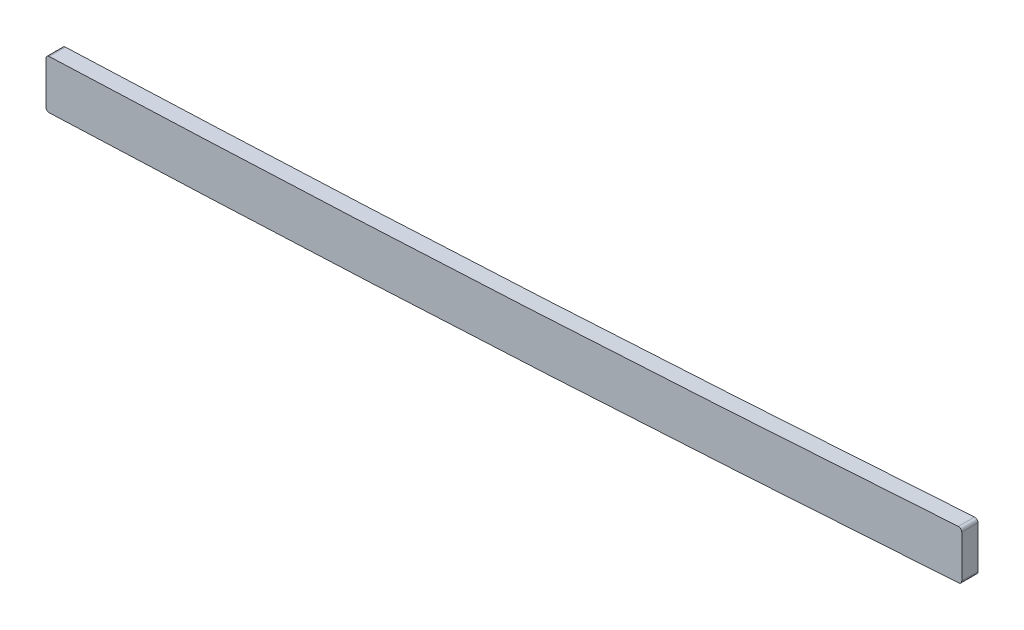
ISO-10303-21;
HEADER;
FILE_DESCRIPTION(('STEP AP214'),'2;1');
FILE_NAME('part.step','',(''),(''),'','','');
FILE_SCHEMA(('AUTOMOTIVE_DESIGN { 1 0 10303 214 1 1 1 1 }'));
ENDSEC;
DATA;
#1=APPLICATION_CONTEXT('core data for automotive mechanical design processes');
#2=APPLICATION_PROTOCOL_DEFINITION('international standard','automotive_design',2000,#1);
#3=PRODUCT_CONTEXT('',#1,'mechanical');
#4=PRODUCT('Part','Part','',(#3));
#5=PRODUCT_RELATED_PRODUCT_CATEGORY('part','',(#4));
#6=PRODUCT_DEFINITION_FORMATION('','',#4);
#7=PRODUCT_DEFINITION_CONTEXT('part definition',#1,'design');
#8=PRODUCT_DEFINITION('design','',#6,#7);
#9=PRODUCT_DEFINITION_SHAPE('','',#8);
#10=(LENGTH_UNIT() NAMED_UNIT(*) SI_UNIT(.MILLI.,.METRE.));
#11=(NAMED_UNIT(*) PLANE_ANGLE_UNIT() SI_UNIT($,.RADIAN.));
#12=(NAMED_UNIT(*) SI_UNIT($,.STERADIAN.) SOLID_ANGLE_UNIT());
#13=UNCERTAINTY_MEASURE_WITH_UNIT(LENGTH_MEASURE(1.E-05),#10,'distance_accuracy_value','');
#14=(GEOMETRIC_REPRESENTATION_CONTEXT(3) GLOBAL_UNCERTAINTY_ASSIGNED_CONTEXT((#13)) GLOBAL_UNIT_ASSIGNED_CONTEXT((#10,
#11,#12)) REPRESENTATION_CONTEXT('',''));
#15=CARTESIAN_POINT('',(0.,0.,0.));
#16=DIRECTION('',(0.,0.,1.));
#17=DIRECTION('',(1.,0.,0.));
#18=AXIS2_PLACEMENT_3D('',#15,#16,#17);
#19=CARTESIAN_POINT('',(2669.54,6.20943054630084E-11,3.175));
#20=DIRECTION('',(1.,0.,0.));
#21=DIRECTION('',(0.,1.,0.));
#22=AXIS2_PLACEMENT_3D('',#19,#20,#21);
#23=PLANE('',#22);
#24=DIRECTION('',(0.,-1.,0.));
#25=VECTOR('',#24,1.);
#26=CARTESIAN_POINT('',(2669.54,6.20943054630084E-11,-3.175));
#27=LINE('',#26,#25);
#28=CARTESIAN_POINT('',(2669.54,8.16576508272443,-3.175));
#29=VERTEX_POINT('',#28);
#30=CARTESIAN_POINT('',(2669.54,-8.38067282995173,-3.175));
#31=VERTEX_POINT('',#30);
#32=EDGE_CURVE('E140',#29,#31,#27,.T.);
#33=ORIENTED_EDGE('',*,*,#32,.F.);
#34=DIRECTION('',(0.,0.,1.));
#35=VECTOR('',#34,1.);
#36=CARTESIAN_POINT('',(2669.54,8.16576508272443,3.175));
#37=LINE('',#36,#35);
#38=CARTESIAN_POINT('',(2669.54,8.16576508272443,3.175));
#39=VERTEX_POINT('',#38);
#40=EDGE_CURVE('E114',#29,#39,#37,.T.);
#41=ORIENTED_EDGE('',*,*,#40,.T.);
#42=DIRECTION('',(0.,-1.,0.));
#43=VECTOR('',#42,1.);
#44=CARTESIAN_POINT('',(2669.54,6.20943054630084E-11,3.175));
#45=LINE('',#44,#43);
#46=CARTESIAN_POINT('',(2669.54,-8.38067282995173,3.175));
#47=VERTEX_POINT('',#46);
#48=EDGE_CURVE('E215',#39,#47,#45,.T.);
#49=ORIENTED_EDGE('',*,*,#48,.T.);
#50=DIRECTION('',(0.,0.,-1.));
#51=VECTOR('',#50,1.);
#52=CARTESIAN_POINT('',(2669.54,-8.38067282995173,3.175));
#53=LINE('',#52,#51);
#54=EDGE_CURVE('E120',#47,#31,#53,.T.);
#55=ORIENTED_EDGE('',*,*,#54,.T.);
#56=EDGE_LOOP('',(#33,#41,#49,#55));
#57=FACE_BOUND('',#56,.T.);
#58=ADVANCED_FACE('F41',(#57),#23,.T.);
#59=CARTESIAN_POINT('',(2698.48667469404,11.4806601503293,3.175));
#60=CARTESIAN_POINT('',(2691.24737670604,10.9833200828121,3.175));
#61=CARTESIAN_POINT('',(2679.19516047804,10.1655376868452,3.175));
#62=CARTESIAN_POINT('',(2662.27652557768,9.03876140898899,3.175));
#63=CARTESIAN_POINT('',(2635.66628230206,7.2924691456857,3.175));
#64=CARTESIAN_POINT('',(2596.85766552893,4.8260568530791,3.175));
#65=CARTESIAN_POINT('',(2545.72974303923,1.75834409257586,3.175));
#66=CARTESIAN_POINT('',(2494.40530570724,-1.09855523520035,3.175));
#67=CARTESIAN_POINT('',(2451.53302226734,-3.26657329681936,3.175));
#68=CARTESIAN_POINT('',(2417.1983167563,-4.86708361008882,3.175));
#69=CARTESIAN_POINT('',(2391.45707691927,-6.00358923536048,3.175));
#70=CARTESIAN_POINT('',(2365.63473630713,-7.08685458139135,3.175));
#71=CARTESIAN_POINT('',(2341.01564201859,-8.07854239792197,3.175));
#72=CARTESIAN_POINT('',(2320.75075371474,-8.87838665592377,3.175));
#73=CARTESIAN_POINT('',(2303.44750893366,-9.5580697754435,3.175));
#74=CARTESIAN_POINT('',(2284.76007664293,-10.2922011195427,3.175));
#75=CARTESIAN_POINT('',(2261.7633474368,-11.2010322967668,3.175));
#76=CARTESIAN_POINT('',(2227.28532971514,-12.5838425566113,3.175));
#77=CARTESIAN_POINT('',(2184.17556939327,-14.3660723604172,3.175));
#78=CARTESIAN_POINT('',(2132.42906611447,-16.6074278682384,3.175));
#79=CARTESIAN_POINT('',(2063.42552339989,-19.708920484548,3.175));
#80=CARTESIAN_POINT('',(1977.17490763451,-23.7005433130483,3.175));
#81=CARTESIAN_POINT('',(1873.73245143151,-28.149389220677,3.175));
#82=CARTESIAN_POINT('',(1770.37461881016,-31.6574686487852,3.175));
#83=CARTESIAN_POINT('',(1667.08568781321,-33.7931175563218,3.175));
#84=CARTESIAN_POINT('',(1581.01109449057,-34.3831888311612,3.175));
#85=CARTESIAN_POINT('',(1512.07397125959,-34.4278026003723,3.175));
#86=CARTESIAN_POINT('',(1443.06151347714,-34.4095104024296,3.175));
#87=CARTESIAN_POINT('',(1356.80092787913,-34.4244328117572,3.175));
#88=CARTESIAN_POINT('',(1218.79462695393,-34.4184647879491,3.175));
#89=CARTESIAN_POINT('',(1115.28902278569,-34.4207027968771,3.175));
#90=CARTESIAN_POINT('',(1046.28548189005,-34.4207027968771,3.175));
#91=B_SPLINE_CURVE_WITH_KNOTS('',3,(#59,#60,#61,#62,#63,#64,#65,#66,#67,#68,#69,#70,#71,#72,#73,
#74,#75,#76,#77,#78,#79,#80,#81,#82,#83,#84,#85,#86,#87,#88,#89,#90),.UNSPECIFIED.,.F.,.F.,(4,1,
1,1,1,1,1,1,1,1,1,1,1,1,1,1,1,1,1,1,1,1,1,1,1,1,1,1,1,4),(100.654804519159,102.842388131745,
104.300777206802,105.766098402935,110.877392286712,115.988686170488,121.099980054264,
126.21127393804,128.766920879929,131.322567821817,133.878214763705,136.433861705593,
138.557690156206,139.83551362715,141.545155589369,144.100802531257,146.656449473146,
151.767743356922,156.879037240698,161.990331124474,172.212918892027,182.43550665958,
192.658094427132,202.880682194685,213.103269962237,218.214563846014,223.32585772979,
233.548445497342,243.771033264895,264.2162088),.UNSPECIFIED.);
#92=DIRECTION('',(0.,0.,-1.));
#93=VECTOR('',#92,1.);
#94=SURFACE_OF_LINEAR_EXTRUSION('',#91,#93);
#95=CARTESIAN_POINT('',(2668.1857171688,9.4329653054066,3.175));
#96=VERTEX_POINT('',#95);
#97=CARTESIAN_POINT('',(2312.62011977482,-9.19769933440686,3.175));
#98=VERTEX_POINT('',#97);
#99=EDGE_CURVE('E130',#96,#98,#91,.T.);
#100=ORIENTED_EDGE('',*,*,#99,.F.);
#101=DIRECTION('',(0.,0.,-1.));
#102=VECTOR('',#101,1.);
#103=CARTESIAN_POINT('',(2668.18571716881,9.43296530540671,3.175));
#104=LINE('',#103,#102);
#105=CARTESIAN_POINT('',(2668.18571716881,9.43296530540666,-3.175));
#106=VERTEX_POINT('',#105);
#107=EDGE_CURVE('E113',#96,#106,#104,.T.);
#108=ORIENTED_EDGE('',*,*,#107,.T.);
#109=CARTESIAN_POINT('',(2698.48667469404,11.4806601503293,-3.175));
#110=CARTESIAN_POINT('',(2691.24737670604,10.9833200828121,-3.175));
#111=CARTESIAN_POINT('',(2679.19516047804,10.1655376868452,-3.175));
#112=CARTESIAN_POINT('',(2662.27652557768,9.03876140898899,-3.175));
#113=CARTESIAN_POINT('',(2635.66628230206,7.2924691456857,-3.175));
#114=CARTESIAN_POINT('',(2596.85766552893,4.8260568530791,-3.175));
#115=CARTESIAN_POINT('',(2545.72974303923,1.75834409257586,-3.175));
#116=CARTESIAN_POINT('',(2494.40530570724,-1.09855523520035,-3.175));
#117=CARTESIAN_POINT('',(2451.53302226734,-3.26657329681936,-3.175));
#118=CARTESIAN_POINT('',(2417.1983167563,-4.86708361008882,-3.175));
#119=CARTESIAN_POINT('',(2391.45707691927,-6.00358923536048,-3.175));
#120=CARTESIAN_POINT('',(2365.63473630713,-7.08685458139135,-3.175));
#121=CARTESIAN_POINT('',(2341.01564201859,-8.07854239792197,-3.175));
#122=CARTESIAN_POINT('',(2320.75075371474,-8.87838665592377,-3.175));
#123=CARTESIAN_POINT('',(2303.44750893366,-9.5580697754435,-3.175));
#124=CARTESIAN_POINT('',(2284.76007664293,-10.2922011195427,-3.175));
#125=CARTESIAN_POINT('',(2261.7633474368,-11.2010322967668,-3.175));
#126=CARTESIAN_POINT('',(2227.28532971514,-12.5838425566113,-3.175));
#127=CARTESIAN_POINT('',(2184.17556939327,-14.3660723604172,-3.175));
#128=CARTESIAN_POINT('',(2132.42906611447,-16.6074278682384,-3.175));
#129=CARTESIAN_POINT('',(2063.42552339989,-19.708920484548,-3.175));
#130=CARTESIAN_POINT('',(1977.17490763451,-23.7005433130483,-3.175));
#131=CARTESIAN_POINT('',(1873.73245143151,-28.149389220677,-3.175));
#132=CARTESIAN_POINT('',(1770.37461881016,-31.6574686487852,-3.175));
#133=CARTESIAN_POINT('',(1667.08568781321,-33.7931175563218,-3.175));
#134=CARTESIAN_POINT('',(1581.01109449057,-34.3831888311612,-3.175));
#135=CARTESIAN_POINT('',(1512.07397125959,-34.4278026003723,-3.175));
#136=CARTESIAN_POINT('',(1443.06151347714,-34.4095104024296,-3.175));
#137=CARTESIAN_POINT('',(1356.80092787913,-34.4244328117572,-3.175));
#138=CARTESIAN_POINT('',(1218.79462695393,-34.4184647879491,-3.175));
#139=CARTESIAN_POINT('',(1115.28902278569,-34.4207027968771,-3.175));
#140=CARTESIAN_POINT('',(1046.28548189005,-34.4207027968771,-3.175));
#141=B_SPLINE_CURVE_WITH_KNOTS('',3,(#109,#110,#111,#112,#113,#114,#115,#116,#117,#118,#119,
#120,#121,#122,#123,#124,#125,#126,#127,#128,#129,#130,#131,#132,#133,#134,#135,#136,#137,#138,
#139,#140),.UNSPECIFIED.,.F.,.F.,(4,1,1,1,1,1,1,1,1,1,1,1,1,1,1,1,1,1,1,1,1,1,1,1,1,1,1,1,1,4),
(100.654804519159,102.842388131745,104.300777206802,105.766098402935,110.877392286712,
115.988686170488,121.099980054264,126.21127393804,128.766920879929,131.322567821817,
133.878214763705,136.433861705593,138.557690156206,139.83551362715,141.545155589369,
144.100802531257,146.656449473146,151.767743356922,156.879037240698,161.990331124474,
172.212918892027,182.43550665958,192.658094427132,202.880682194685,213.103269962237,
218.214563846014,223.32585772979,233.548445497342,243.771033264895,264.2162088),.UNSPECIFIED.);
#142=CARTESIAN_POINT('',(2312.62011977482,-9.19769933440686,-3.175));
#143=VERTEX_POINT('',#142);
#144=EDGE_CURVE('E127',#106,#143,#141,.T.);
#145=ORIENTED_EDGE('',*,*,#144,.T.);
#146=DIRECTION('',(0.,0.,-1.));
#147=VECTOR('',#146,1.);
#148=CARTESIAN_POINT('',(2312.62011977482,-9.19769933440686,-3.175));
#149=LINE('',#148,#147);
#150=EDGE_CURVE('E133',#143,#98,#149,.F.);
#151=ORIENTED_EDGE('',*,*,#150,.T.);
#152=EDGE_LOOP('',(#100,#108,#145,#151));
#153=FACE_BOUND('',#152,.T.);
#154=ADVANCED_FACE('F126',(#153),#94,.F.);
#155=CARTESIAN_POINT('',(2311.4,5.38412677974243E-11,3.175));
#156=DIRECTION('',(1.,0.,0.));
#157=DIRECTION('',(0.,1.,0.));
#158=AXIS2_PLACEMENT_3D('',#155,#156,#157);
#159=PLANE('',#158);
#160=DIRECTION('',(0.,-1.,0.));
#161=VECTOR('',#160,1.);
#162=CARTESIAN_POINT('',(2311.4,5.38412677974243E-11,3.175));
#163=LINE('',#162,#161);
#164=CARTESIAN_POINT('',(2311.4,-10.4667194142858,3.175));
#165=VERTEX_POINT('',#164);
#166=CARTESIAN_POINT('',(2311.4,-26.989466917101,3.175));
#167=VERTEX_POINT('',#166);
#168=EDGE_CURVE('E209',#165,#167,#163,.T.);
#169=ORIENTED_EDGE('',*,*,#168,.F.);
#170=DIRECTION('',(0.,0.,-1.));
#171=VECTOR('',#170,1.);
#172=CARTESIAN_POINT('',(2311.4,-10.4667194142858,3.175));
#173=LINE('',#172,#171);
#174=CARTESIAN_POINT('',(2311.4,-10.4667194142858,-3.175));
#175=VERTEX_POINT('',#174);
#176=EDGE_CURVE('E11',#165,#175,#173,.T.);
#177=ORIENTED_EDGE('',*,*,#176,.T.);
#178=DIRECTION('',(0.,-1.,0.));
#179=VECTOR('',#178,1.);
#180=CARTESIAN_POINT('',(2311.4,5.38412677974243E-11,-3.175));
#181=LINE('',#180,#179);
#182=CARTESIAN_POINT('',(2311.4,-26.989466917101,-3.175));
#183=VERTEX_POINT('',#182);
#184=EDGE_CURVE('E139',#175,#183,#181,.T.);
#185=ORIENTED_EDGE('',*,*,#184,.T.);
#186=DIRECTION('',(0.,0.,1.));
#187=VECTOR('',#186,1.);
#188=CARTESIAN_POINT('',(2311.4,-26.989466917101,3.175));
#189=LINE('',#188,#187);
#190=EDGE_CURVE('E50',#183,#167,#189,.T.);
#191=ORIENTED_EDGE('',*,*,#190,.T.);
#192=EDGE_LOOP('',(#169,#177,#185,#191));
#193=FACE_BOUND('',#192,.T.);
#194=ADVANCED_FACE('F179',(#193),#159,.F.);
#195=CARTESIAN_POINT('',(2699.79233294449,-7.52454325644929,3.175));
#196=CARTESIAN_POINT('',(2639.63682069028,-11.6572294058032,3.175));
#197=CARTESIAN_POINT('',(2579.48130742255,-15.435846921513,3.175));
#198=CARTESIAN_POINT('',(2518.49810546626,-19.1485286488731,3.175));
#199=CARTESIAN_POINT('',(2436.3555443117,-23.2523639114786,3.175));
#200=CARTESIAN_POINT('',(2354.21298315715,-26.6314864233564,3.175));
#201=CARTESIAN_POINT('',(2332.5703304682,-27.4809881692809,3.175));
#202=CARTESIAN_POINT('',(2156.26863942885,-34.3777685431634,3.175));
#203=CARTESIAN_POINT('',(1979.96694737597,-41.6286312484567,3.175));
#204=CARTESIAN_POINT('',(1824.11427763497,-52.7712658766203,3.175));
#205=CARTESIAN_POINT('',(1636.92860677809,-53.5795698486924,3.175));
#206=CARTESIAN_POINT('',(1449.7429359212,-53.4540246131279,3.175));
#207=CARTESIAN_POINT('',(1418.00673093479,-53.4707027968771,3.175));
#208=CARTESIAN_POINT('',(1324.89933614602,-53.4707027968771,3.175));
#209=CARTESIAN_POINT('',(1231.79194034372,-53.4707027968771,3.175));
#210=CARTESIAN_POINT('',(1170.4412693194,-53.4707027968771,3.175));
#211=CARTESIAN_POINT('',(1108.78407581299,-53.4707027968771,3.175));
#212=CARTESIAN_POINT('',(1047.12688234629,-53.4707027968771,3.175));
#213=CARTESIAN_POINT('',(1046.84641418849,-53.4707027968771,3.175));
#214=CARTESIAN_POINT('',(1046.56594718406,-53.4707027968771,3.175));
#215=CARTESIAN_POINT('',(1046.28548189005,-53.4707027968771,3.175));
#216=(BOUNDED_CURVE() B_SPLINE_CURVE(5,(#195,#196,#197,#198,#199,#200,#201,#202,#203,#204,#205,
#206,#207,#208,#209,#210,#211,#212,#213,#214,#215),.UNSPECIFIED.,.F.,
.F.) B_SPLINE_CURVE_WITH_KNOTS((6,3,3,3,3,3,6),(100.654804519159,130.927896619159,
141.337054719159,218.101815019159,233.772059419159,264.077723219159,264.2162088),
.UNSPECIFIED.) CURVE() GEOMETRIC_REPRESENTATION_ITEM() RATIONAL_B_SPLINE_CURVE((1.,1.,1.,1.,1.,
1.,1.,1.,1.,1.,1.,1.,1.,1.,1.,1.,1.,1.,1.,1.,1.)) REPRESENTATION_ITEM(''));
#217=DIRECTION('',(0.,0.,-1.));
#218=VECTOR('',#217,1.);
#219=SURFACE_OF_LINEAR_EXTRUSION('',#216,#218);
#220=CARTESIAN_POINT('',(2312.71987514369,-28.2584871967033,-3.175));
#221=CARTESIAN_POINT('',(2329.40547783021,-27.6027081900987,-3.175));
#222=CARTESIAN_POINT('',(2346.19503632831,-26.9408313965916,-3.175));
#223=CARTESIAN_POINT('',(2363.08398911934,-26.2644441857733,-3.175));
#224=CARTESIAN_POINT('',(2434.40380877238,-23.2965631449422,-3.175));
#225=CARTESIAN_POINT('',(2505.72362842541,-19.7823585871208,-3.175));
#226=CARTESIAN_POINT('',(2560.35960699296,-16.5784214349998,-3.175));
#227=CARTESIAN_POINT('',(2614.44199917946,-13.229682637772,-3.175));
#228=CARTESIAN_POINT('',(2668.35419031106,-9.64787920285397,-3.175));
#229=(BOUNDED_CURVE() B_SPLINE_CURVE(5,(#220,#221,#222,#223,#224,#225,#226,#227,#228),
.UNSPECIFIED.,.F.,.F.) B_SPLINE_CURVE_WITH_KNOTS((6,3,6),(103.818173568317,112.030586893093,
139.140309943934),
.UNSPECIFIED.) CURVE() GEOMETRIC_REPRESENTATION_ITEM() RATIONAL_B_SPLINE_CURVE((1.,1.,1.,1.,1.,
1.,1.,1.,1.)) REPRESENTATION_ITEM(''));
#230=CARTESIAN_POINT('',(2668.35419046547,-9.64788152706516,-3.175));
#231=VERTEX_POINT('',#230);
#232=CARTESIAN_POINT('',(2312.71987502721,-28.2584842330797,-3.175));
#233=VERTEX_POINT('',#232);
#234=EDGE_CURVE('E145',#231,#233,#229,.F.);
#235=ORIENTED_EDGE('',*,*,#234,.F.);
#236=DIRECTION('',(0.,0.,-1.));
#237=VECTOR('',#236,1.);
#238=CARTESIAN_POINT('',(2668.35419031102,-9.64787920285633,-3.175));
#239=LINE('',#238,#237);
#240=CARTESIAN_POINT('',(2668.35419046551,-9.64788152744234,3.175));
#241=VERTEX_POINT('',#240);
#242=EDGE_CURVE('E64',#231,#241,#239,.F.);
#243=ORIENTED_EDGE('',*,*,#242,.T.);
#244=CARTESIAN_POINT('',(2668.35419031106,-9.64787920285402,3.175));
#245=CARTESIAN_POINT('',(2614.44199917946,-13.229682637772,3.175));
#246=CARTESIAN_POINT('',(2560.35960699296,-16.5784214349999,3.175));
#247=CARTESIAN_POINT('',(2505.72362842541,-19.7823585871209,3.175));
#248=CARTESIAN_POINT('',(2434.40380877238,-23.2965631449419,3.175));
#249=CARTESIAN_POINT('',(2363.08398911935,-26.2644441857729,3.175));
#250=CARTESIAN_POINT('',(2346.19503632833,-26.9408313965909,3.175));
#251=CARTESIAN_POINT('',(2329.40547783023,-27.6027081900979,3.175));
#252=CARTESIAN_POINT('',(2312.71987514372,-28.2584871967023,3.175));
#253=(BOUNDED_CURVE() B_SPLINE_CURVE(5,(#244,#245,#246,#247,#248,#249,#250,#251,#252),
.UNSPECIFIED.,.F.,.F.) B_SPLINE_CURVE_WITH_KNOTS((6,3,6),(103.818173568318,130.927896619159,
139.140309943932),
.UNSPECIFIED.) CURVE() GEOMETRIC_REPRESENTATION_ITEM() RATIONAL_B_SPLINE_CURVE((1.,1.,1.,1.,1.,
1.,1.,1.,1.)) REPRESENTATION_ITEM(''));
#254=CARTESIAN_POINT('',(2312.7198750272,-28.2584842327322,3.175));
#255=VERTEX_POINT('',#254);
#256=EDGE_CURVE('E207',#241,#255,#253,.T.);
#257=ORIENTED_EDGE('',*,*,#256,.T.);
#258=DIRECTION('',(0.,0.,-1.));
#259=VECTOR('',#258,1.);
#260=CARTESIAN_POINT('',(2312.71987514529,-28.2584871966404,3.175));
#261=LINE('',#260,#259);
#262=EDGE_CURVE('E247',#255,#233,#261,.T.);
#263=ORIENTED_EDGE('',*,*,#262,.T.);
#264=EDGE_LOOP('',(#235,#243,#257,#263));
#265=FACE_BOUND('',#264,.T.);
#266=ADVANCED_FACE('F168',(#265),#219,.T.);
#267=CARTESIAN_POINT('',(0.,0.,3.175));
#268=DIRECTION('',(0.,0.,1.));
#269=DIRECTION('',(1.,0.,0.));
#270=AXIS2_PLACEMENT_3D('',#267,#268,#269);
#271=PLANE('',#270);
#272=ORIENTED_EDGE('',*,*,#48,.F.);
#273=CARTESIAN_POINT('',(2668.27,8.1657650827244,3.175));
#274=DIRECTION('',(0.,0.,1.));
#275=DIRECTION('',(1.,0.,0.));
#276=AXIS2_PLACEMENT_3D('',#273,#274,#275);
#277=CIRCLE('',#276,1.27);
#278=EDGE_CURVE('E242',#39,#96,#277,.T.);
#279=ORIENTED_EDGE('',*,*,#278,.T.);
#280=ORIENTED_EDGE('',*,*,#99,.T.);
#281=CARTESIAN_POINT('',(2312.67,-10.4667194142858,3.175));
#282=DIRECTION('',(0.,0.,1.));
#283=DIRECTION('',(1.,0.,0.));
#284=AXIS2_PLACEMENT_3D('',#281,#282,#283);
#285=CIRCLE('',#284,1.27);
#286=EDGE_CURVE('E232',#98,#165,#285,.T.);
#287=ORIENTED_EDGE('',*,*,#286,.T.);
#288=ORIENTED_EDGE('',*,*,#168,.T.);
#289=CARTESIAN_POINT('',(2312.67,-26.989466917101,3.175));
#290=DIRECTION('',(0.,0.,1.));
#291=DIRECTION('',(1.,0.,0.));
#292=AXIS2_PLACEMENT_3D('',#289,#290,#291);
#293=CIRCLE('',#292,1.27);
#294=EDGE_CURVE('E57',#167,#255,#293,.T.);
#295=ORIENTED_EDGE('',*,*,#294,.T.);
#296=ORIENTED_EDGE('',*,*,#256,.F.);
#297=CARTESIAN_POINT('',(2668.27,-8.38067282995176,3.175));
#298=DIRECTION('',(0.,0.,1.));
#299=DIRECTION('',(1.,0.,0.));
#300=AXIS2_PLACEMENT_3D('',#297,#298,#299);
#301=CIRCLE('',#300,1.27);
#302=EDGE_CURVE('E235',#241,#47,#301,.T.);
#303=ORIENTED_EDGE('',*,*,#302,.T.);
#304=EDGE_LOOP('',(#272,#279,#280,#287,#288,#295,#296,#303));
#305=FACE_BOUND('',#304,.T.);
#306=ADVANCED_FACE('F178',(#305),#271,.T.);
#307=CARTESIAN_POINT('',(0.,0.,-3.175));
#308=DIRECTION('',(0.,0.,1.));
#309=DIRECTION('',(1.,0.,0.));
#310=AXIS2_PLACEMENT_3D('',#307,#308,#309);
#311=PLANE('',#310);
#312=ORIENTED_EDGE('',*,*,#144,.F.);
#313=CARTESIAN_POINT('',(2668.27,8.1657650827244,-3.175));
#314=DIRECTION('',(0.,0.,1.));
#315=DIRECTION('',(1.,0.,0.));
#316=AXIS2_PLACEMENT_3D('',#313,#314,#315);
#317=CIRCLE('',#316,1.27);
#318=EDGE_CURVE('E109',#106,#29,#317,.F.);
#319=ORIENTED_EDGE('',*,*,#318,.T.);
#320=ORIENTED_EDGE('',*,*,#32,.T.);
#321=CARTESIAN_POINT('',(2668.27,-8.38067282995176,-3.175));
#322=DIRECTION('',(0.,0.,1.));
#323=DIRECTION('',(1.,0.,0.));
#324=AXIS2_PLACEMENT_3D('',#321,#322,#323);
#325=CIRCLE('',#324,1.27);
#326=EDGE_CURVE('E121',#31,#231,#325,.F.);
#327=ORIENTED_EDGE('',*,*,#326,.T.);
#328=ORIENTED_EDGE('',*,*,#234,.T.);
#329=CARTESIAN_POINT('',(2312.67,-26.989466917101,-3.175));
#330=DIRECTION('',(0.,0.,1.));
#331=DIRECTION('',(1.,0.,0.));
#332=AXIS2_PLACEMENT_3D('',#329,#330,#331);
#333=CIRCLE('',#332,1.27);
#334=EDGE_CURVE('E132',#233,#183,#333,.F.);
#335=ORIENTED_EDGE('',*,*,#334,.T.);
#336=ORIENTED_EDGE('',*,*,#184,.F.);
#337=CARTESIAN_POINT('',(2312.67,-10.4667194142858,-3.175));
#338=DIRECTION('',(0.,0.,1.));
#339=DIRECTION('',(1.,0.,0.));
#340=AXIS2_PLACEMENT_3D('',#337,#338,#339);
#341=CIRCLE('',#340,1.27);
#342=EDGE_CURVE('E137',#175,#143,#341,.F.);
#343=ORIENTED_EDGE('',*,*,#342,.T.);
#344=EDGE_LOOP('',(#312,#319,#320,#327,#328,#335,#336,#343));
#345=FACE_BOUND('',#344,.T.);
#346=ADVANCED_FACE('F135',(#345),#311,.F.);
#347=CARTESIAN_POINT('',(2668.27,8.1657650827244,0.));
#348=DIRECTION('',(0.,0.,-1.));
#349=DIRECTION('',(-1.,0.,0.));
#350=AXIS2_PLACEMENT_3D('',#347,#348,#349);
#351=CYLINDRICAL_SURFACE('',#350,1.27);
#352=ORIENTED_EDGE('',*,*,#278,.F.);
#353=ORIENTED_EDGE('',*,*,#40,.F.);
#354=ORIENTED_EDGE('',*,*,#318,.F.);
#355=ORIENTED_EDGE('',*,*,#107,.F.);
#356=EDGE_LOOP('',(#352,#353,#354,#355));
#357=FACE_BOUND('',#356,.T.);
#358=ADVANCED_FACE('F112',(#357),#351,.T.);
#359=CARTESIAN_POINT('',(2668.27,-8.38067282995176,0.));
#360=DIRECTION('',(0.,0.,-1.));
#361=DIRECTION('',(-1.,0.,0.));
#362=AXIS2_PLACEMENT_3D('',#359,#360,#361);
#363=CYLINDRICAL_SURFACE('',#362,1.27);
#364=ORIENTED_EDGE('',*,*,#302,.F.);
#365=ORIENTED_EDGE('',*,*,#242,.F.);
#366=ORIENTED_EDGE('',*,*,#326,.F.);
#367=ORIENTED_EDGE('',*,*,#54,.F.);
#368=EDGE_LOOP('',(#364,#365,#366,#367));
#369=FACE_BOUND('',#368,.T.);
#370=ADVANCED_FACE('F270',(#369),#363,.T.);
#371=CARTESIAN_POINT('',(2312.67,-10.4667194142858,0.));
#372=DIRECTION('',(0.,0.,-1.));
#373=DIRECTION('',(-1.,0.,0.));
#374=AXIS2_PLACEMENT_3D('',#371,#372,#373);
#375=CYLINDRICAL_SURFACE('',#374,1.27);
#376=ORIENTED_EDGE('',*,*,#286,.F.);
#377=ORIENTED_EDGE('',*,*,#150,.F.);
#378=ORIENTED_EDGE('',*,*,#342,.F.);
#379=ORIENTED_EDGE('',*,*,#176,.F.);
#380=EDGE_LOOP('',(#376,#377,#378,#379));
#381=FACE_BOUND('',#380,.T.);
#382=ADVANCED_FACE('F280',(#381),#375,.T.);
#383=CARTESIAN_POINT('',(2312.67,-26.989466917101,0.));
#384=DIRECTION('',(0.,0.,-1.));
#385=DIRECTION('',(-1.,0.,0.));
#386=AXIS2_PLACEMENT_3D('',#383,#384,#385);
#387=CYLINDRICAL_SURFACE('',#386,1.27);
#388=ORIENTED_EDGE('',*,*,#294,.F.);
#389=ORIENTED_EDGE('',*,*,#190,.F.);
#390=ORIENTED_EDGE('',*,*,#334,.F.);
#391=ORIENTED_EDGE('',*,*,#262,.F.);
#392=EDGE_LOOP('',(#388,#389,#390,#391));
#393=FACE_BOUND('',#392,.T.);
#394=ADVANCED_FACE('F43',(#393),#387,.T.);
#395=CLOSED_SHELL('',(#58,#154,#194,#266,#306,#346,#358,#370,#382,#394));
#396=MANIFOLD_SOLID_BREP('B2',#395);
#397=ADVANCED_BREP_SHAPE_REPRESENTATION('',(#18,#396),#14);
#398=SHAPE_DEFINITION_REPRESENTATION(#9,#397);
ENDSEC;
END-ISO-10303-21;
